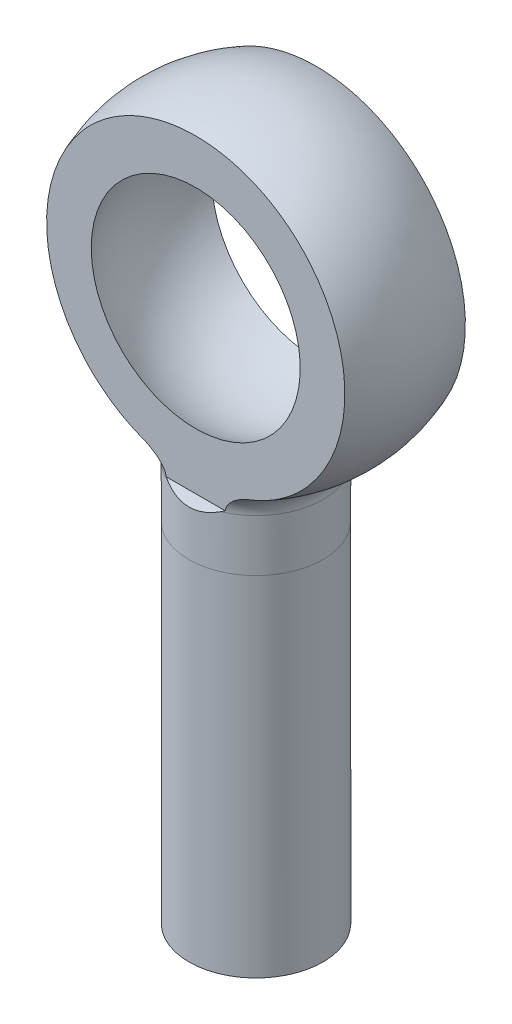
ISO-10303-21;
HEADER;
FILE_DESCRIPTION(('STEP AP214'),'2;1');
FILE_NAME('part.step','',(''),(''),'','','');
FILE_SCHEMA(('AUTOMOTIVE_DESIGN { 1 0 10303 214 1 1 1 1 }'));
ENDSEC;
DATA;
#1=APPLICATION_CONTEXT('core data for automotive mechanical design processes');
#2=APPLICATION_PROTOCOL_DEFINITION('international standard','automotive_design',2000,#1);
#3=PRODUCT_CONTEXT('',#1,'mechanical');
#4=PRODUCT('Part','Part','',(#3));
#5=PRODUCT_RELATED_PRODUCT_CATEGORY('part','',(#4));
#6=PRODUCT_DEFINITION_FORMATION('','',#4);
#7=PRODUCT_DEFINITION_CONTEXT('part definition',#1,'design');
#8=PRODUCT_DEFINITION('design','',#6,#7);
#9=PRODUCT_DEFINITION_SHAPE('','',#8);
#10=(LENGTH_UNIT() NAMED_UNIT(*) SI_UNIT(.MILLI.,.METRE.));
#11=(NAMED_UNIT(*) PLANE_ANGLE_UNIT() SI_UNIT($,.RADIAN.));
#12=(NAMED_UNIT(*) SI_UNIT($,.STERADIAN.) SOLID_ANGLE_UNIT());
#13=UNCERTAINTY_MEASURE_WITH_UNIT(LENGTH_MEASURE(1.E-05),#10,'distance_accuracy_value','');
#14=(GEOMETRIC_REPRESENTATION_CONTEXT(3) GLOBAL_UNCERTAINTY_ASSIGNED_CONTEXT((#13)) GLOBAL_UNIT_ASSIGNED_CONTEXT((#10,
#11,#12)) REPRESENTATION_CONTEXT('',''));
#15=CARTESIAN_POINT('',(0.,0.,0.));
#16=DIRECTION('',(0.,0.,1.));
#17=DIRECTION('',(1.,0.,0.));
#18=AXIS2_PLACEMENT_3D('',#15,#16,#17);
#19=CARTESIAN_POINT('',(0.,-15.875,0.));
#20=DIRECTION('',(0.,-1.,0.));
#21=DIRECTION('',(0.,0.,-1.));
#22=AXIS2_PLACEMENT_3D('',#19,#20,#21);
#23=CYLINDRICAL_SURFACE('',#22,7.9375);
#24=CARTESIAN_POINT('',(0.,-66.675,0.));
#25=DIRECTION('',(0.,1.,0.));
#26=DIRECTION('',(0.,0.,1.));
#27=AXIS2_PLACEMENT_3D('',#24,#25,#26);
#28=CIRCLE('',#27,7.9375);
#29=CARTESIAN_POINT('',(0.,-66.675,7.9375));
#30=VERTEX_POINT('',#29);
#31=EDGE_CURVE('E210',#30,#30,#28,.T.);
#32=ORIENTED_EDGE('',*,*,#31,.T.);
#33=EDGE_LOOP('',(#32));
#34=FACE_BOUND('',#33,.T.);
#35=CARTESIAN_POINT('',(0.,-25.4,0.));
#36=DIRECTION('',(0.,1.,0.));
#37=DIRECTION('',(0.,0.,1.));
#38=AXIS2_PLACEMENT_3D('',#35,#36,#37);
#39=CIRCLE('',#38,7.9375);
#40=CARTESIAN_POINT('',(0.,-25.4,7.9375));
#41=VERTEX_POINT('',#40);
#42=EDGE_CURVE('E11',#41,#41,#39,.T.);
#43=ORIENTED_EDGE('',*,*,#42,.F.);
#44=EDGE_LOOP('',(#43));
#45=FACE_BOUND('',#44,.T.);
#46=ADVANCED_FACE('F32',(#34,#45),#23,.T.);
#47=CARTESIAN_POINT('',(0.,-19.2474145991091,0.));
#48=DIRECTION('',(0.,1.,0.));
#49=DIRECTION('',(0.,0.,1.));
#50=AXIS2_PLACEMENT_3D('',#47,#48,#49);
#51=TOROIDAL_SURFACE('',#50,11.1125,3.175);
#52=CARTESIAN_POINT('',(0.,-19.2474145991091,0.));
#53=DIRECTION('',(0.,1.,0.));
#54=DIRECTION('',(0.,0.,1.));
#55=AXIS2_PLACEMENT_3D('',#52,#53,#54);
#56=CIRCLE('',#55,7.9375);
#57=CARTESIAN_POINT('',(-3.10955935652339,-19.2474145991091,7.30305051730151));
#58=VERTEX_POINT('',#57);
#59=CARTESIAN_POINT('',(-3.1095593565234,-19.2474145991091,-7.30305051730151));
#60=VERTEX_POINT('',#59);
#61=EDGE_CURVE('E49',#58,#60,#56,.F.);
#62=ORIENTED_EDGE('',*,*,#61,.F.);
#63=CARTESIAN_POINT('',(-3.10955935652339,-19.2474145991091,7.30305051730151));
#64=CARTESIAN_POINT('',(-3.17304214766124,-19.2151631506396,7.27598833878579));
#65=CARTESIAN_POINT('',(-3.23623480647958,-19.1825862073713,7.2486530377045));
#66=CARTESIAN_POINT('',(-3.36203984117233,-19.1167813408121,7.19343619844495));
#67=CARTESIAN_POINT('',(-3.4246522172156,-19.0835534177105,7.16555466042564));
#68=CARTESIAN_POINT('',(-3.48697446110822,-19.0499999999997,7.13739999999972));
#69=B_SPLINE_CURVE_WITH_KNOTS('',3,(#63,#64,#65,#66,#67,#68),.UNSPECIFIED.,.F.,.F.,(4,2,4),(0.,
0.228508407762078,0.4570167490272),.UNSPECIFIED.);
#70=CARTESIAN_POINT('',(-3.48697446110849,-19.05,7.1374));
#71=VERTEX_POINT('',#70);
#72=EDGE_CURVE('E43',#58,#71,#69,.T.);
#73=ORIENTED_EDGE('',*,*,#72,.T.);
#74=CARTESIAN_POINT('',(-8.18634441000215,-16.0824007987106,7.1374));
#75=CARTESIAN_POINT('',(-8.45461033069829,-16.066328733575,7.1374));
#76=CARTESIAN_POINT('',(-8.72429189484738,-16.0693292136249,7.1374));
#77=CARTESIAN_POINT('',(-9.25997540927952,-16.1182879434974,7.1374));
#78=CARTESIAN_POINT('',(-9.52597713424766,-16.1642488120548,7.1374));
#79=CARTESIAN_POINT('',(-9.99599897455413,-16.290236551553,7.1374));
#80=CARTESIAN_POINT('',(-10.2021623288707,-16.362091543629,7.1374));
#81=CARTESIAN_POINT('',(-10.5005483189457,-16.494180446961,7.1374));
#82=CARTESIAN_POINT('',(-10.5982359006827,-16.5422842974101,7.1374));
#83=CARTESIAN_POINT('',(-10.7891149384266,-16.6466762160984,7.1374));
#84=CARTESIAN_POINT('',(-10.8823084212089,-16.7029605482042,7.1374));
#85=CARTESIAN_POINT('',(-11.0641232863725,-16.8242793154715,7.1374));
#86=CARTESIAN_POINT('',(-11.1526922817949,-16.8893924511942,7.1374));
#87=CARTESIAN_POINT('',(-11.3231772783695,-17.0277487216986,7.1374));
#88=CARTESIAN_POINT('',(-11.4050969025683,-17.1009873769289,7.1374));
#89=CARTESIAN_POINT('',(-11.5611888059373,-17.2552623330767,7.1374));
#90=CARTESIAN_POINT('',(-11.6353641026378,-17.3362955730566,7.1374));
#91=CARTESIAN_POINT('',(-11.7748616747627,-17.5056534955936,7.1374));
#92=CARTESIAN_POINT('',(-11.8401859375918,-17.5939765341134,7.1374));
#93=CARTESIAN_POINT('',(-11.9518550028769,-17.7634687505778,7.1374));
#94=CARTESIAN_POINT('',(-11.9995772010357,-17.8437326939107,7.1374));
#95=CARTESIAN_POINT('',(-12.0871933321947,-18.0084183127981,7.1374));
#96=CARTESIAN_POINT('',(-12.1270886776974,-18.0928392347013,7.1374));
#97=CARTESIAN_POINT('',(-12.1984624755193,-18.2651065840933,7.1374));
#98=CARTESIAN_POINT('',(-12.2299471577221,-18.3529504206105,7.1374));
#99=CARTESIAN_POINT('',(-12.284065581669,-18.5312902455785,7.1374));
#100=CARTESIAN_POINT('',(-12.3067003283058,-18.621785931662,7.1374));
#101=CARTESIAN_POINT('',(-12.356168394066,-18.8727101312676,7.1374));
#102=CARTESIAN_POINT('',(-12.3736084692336,-19.0351027489541,7.1374));
#103=CARTESIAN_POINT('',(-12.3794965767019,-19.3602853887218,7.1374));
#104=CARTESIAN_POINT('',(-12.3679555677326,-19.523075237341,7.1374));
#105=CARTESIAN_POINT('',(-12.3177204988198,-19.8366375954012,7.1374));
#106=CARTESIAN_POINT('',(-12.280309331988,-19.9876174317936,7.1374));
#107=CARTESIAN_POINT('',(-12.1813347469724,-20.2813997296524,7.1374));
#108=CARTESIAN_POINT('',(-12.119770433459,-20.4242018877567,7.1374));
#109=CARTESIAN_POINT('',(-11.9729311417626,-20.702131982471,7.1374));
#110=CARTESIAN_POINT('',(-11.8870414026876,-20.8369337574829,7.1374));
#111=CARTESIAN_POINT('',(-11.6955986679655,-21.0917110801134,7.1374));
#112=CARTESIAN_POINT('',(-11.5900399602618,-21.2116823039195,7.1374));
#113=CARTESIAN_POINT('',(-11.3524936367968,-21.445104843377,7.1374));
#114=CARTESIAN_POINT('',(-11.2189837826038,-21.5570026467679,7.1374));
#115=CARTESIAN_POINT('',(-10.9370877782918,-21.7600442047659,7.1374));
#116=CARTESIAN_POINT('',(-10.7886956194449,-21.8511795275458,7.1374));
#117=CARTESIAN_POINT('',(-10.4591590868066,-22.0239842477611,7.1374));
#118=CARTESIAN_POINT('',(-10.2763540691325,-22.1024794140072,7.1374));
#119=CARTESIAN_POINT('',(-9.90158932709872,-22.2330280256659,7.1374));
#120=CARTESIAN_POINT('',(-9.70962312408036,-22.2850624459957,7.1374));
#121=CARTESIAN_POINT('',(-9.23137770456704,-22.3822674936143,7.1374));
#122=CARTESIAN_POINT('',(-8.94219804051009,-22.4133612960367,7.1374));
#123=CARTESIAN_POINT('',(-8.36268572043561,-22.4280681437897,7.1374));
#124=CARTESIAN_POINT('',(-8.07235192805783,-22.411596469728,7.1374));
#125=CARTESIAN_POINT('',(-7.42103544275628,-22.3269836642698,7.1374));
#126=CARTESIAN_POINT('',(-7.06164163244379,-22.2463471608774,7.1374));
#127=CARTESIAN_POINT('',(-6.53626316888111,-22.0825652745542,7.1374));
#128=CARTESIAN_POINT('',(-6.36318595614582,-22.020714819537,7.1374));
#129=CARTESIAN_POINT('',(-6.02248255372552,-21.8834270614101,7.1374));
#130=CARTESIAN_POINT('',(-5.85485470507076,-21.8079939399267,7.1374));
#131=CARTESIAN_POINT('',(-5.56193792981059,-21.6618062540766,7.1374));
#132=CARTESIAN_POINT('',(-5.4353664310204,-21.5935991548125,7.1374));
#133=CARTESIAN_POINT('',(-5.18694210166514,-21.4490856454484,7.1374));
#134=CARTESIAN_POINT('',(-5.06508834569833,-21.3727808348411,7.1374));
#135=CARTESIAN_POINT('',(-4.82751058473455,-21.2120528910142,7.1374));
#136=CARTESIAN_POINT('',(-4.71176500952862,-21.1276617706616,7.1374));
#137=CARTESIAN_POINT('',(-4.4874794456567,-20.9498793887008,7.1374));
#138=CARTESIAN_POINT('',(-4.37893356771653,-20.8564956401966,7.1374));
#139=CARTESIAN_POINT('',(-4.18761379011379,-20.6747340780156,7.1374));
#140=CARTESIAN_POINT('',(-4.10345473361283,-20.5878290000602,7.1374));
#141=CARTESIAN_POINT('',(-3.9444935388949,-20.4054511903466,7.1374));
#142=CARTESIAN_POINT('',(-3.86970928552169,-20.3099626616356,7.1374));
#143=CARTESIAN_POINT('',(-3.73287692733787,-20.1076336356136,7.1374));
#144=CARTESIAN_POINT('',(-3.67104739265319,-20.0006383502405,7.1374));
#145=CARTESIAN_POINT('',(-3.59460458719691,-19.8329521424042,7.1374));
#146=CARTESIAN_POINT('',(-3.57186584443942,-19.7759623940727,7.1374));
#147=CARTESIAN_POINT('',(-3.53281638783866,-19.659844459772,7.1374));
#148=CARTESIAN_POINT('',(-3.51650051615519,-19.6007180314824,7.1374));
#149=CARTESIAN_POINT('',(-3.48730511157464,-19.4619734053873,7.1374));
#150=CARTESIAN_POINT('',(-3.47712021459319,-19.3817588782844,7.1374));
#151=CARTESIAN_POINT('',(-3.47088133666928,-19.2207971506109,7.1374));
#152=CARTESIAN_POINT('',(-3.47482364307395,-19.1400500955567,7.1374));
#153=CARTESIAN_POINT('',(-3.49625415512454,-18.9807255752151,7.1374));
#154=CARTESIAN_POINT('',(-3.51369396974151,-18.9021413957269,7.1374));
#155=CARTESIAN_POINT('',(-3.56010188121729,-18.7484705459903,7.1374));
#156=CARTESIAN_POINT('',(-3.5890831328836,-18.6733879763061,7.1374));
#157=CARTESIAN_POINT('',(-3.67820608551895,-18.4795508421502,7.1374));
#158=CARTESIAN_POINT('',(-3.7463124583019,-18.3644973102697,7.1374));
#159=CARTESIAN_POINT('',(-3.8987591200324,-18.1456690582267,7.1374));
#160=CARTESIAN_POINT('',(-3.98315676686753,-18.041936277909,7.1374));
#161=CARTESIAN_POINT('',(-4.15884663707292,-17.8486984681013,7.1374));
#162=CARTESIAN_POINT('',(-4.24968256422073,-17.7587720401846,7.1374));
#163=CARTESIAN_POINT('',(-4.43859531349293,-17.5867983531347,7.1374));
#164=CARTESIAN_POINT('',(-4.53667850414914,-17.5047581732481,7.1374));
#165=CARTESIAN_POINT('',(-4.73859527174432,-17.3476510074325,7.1374));
#166=CARTESIAN_POINT('',(-4.84244111755216,-17.2725998875532,7.1374));
#167=CARTESIAN_POINT('',(-5.05466352696943,-17.1291782661817,7.1374));
#168=CARTESIAN_POINT('',(-5.16304138338956,-17.0608096897855,7.1374));
#169=CARTESIAN_POINT('',(-5.43829658059268,-16.8982093662911,7.1374));
#170=CARTESIAN_POINT('',(-5.6075393903804,-16.8079586232153,7.1374));
#171=CARTESIAN_POINT('',(-5.95300516187439,-16.6417826052334,7.1374));
#172=CARTESIAN_POINT('',(-6.12923206342988,-16.5658655595002,7.1374));
#173=CARTESIAN_POINT('',(-6.4867794892714,-16.4292301720825,7.1374));
#174=CARTESIAN_POINT('',(-6.66807979171416,-16.368459019936,7.1374));
#175=CARTESIAN_POINT('',(-7.03522755539077,-16.2627741977119,7.1374));
#176=CARTESIAN_POINT('',(-7.22107366302185,-16.2178558671591,7.1374));
#177=CARTESIAN_POINT('',(-7.53691915138977,-16.1566388188555,7.1374));
#178=CARTESIAN_POINT('',(-7.66604350605597,-16.1357818155938,7.1374));
#179=CARTESIAN_POINT('',(-7.92544773729248,-16.102572854058,7.1374));
#180=CARTESIAN_POINT('',(-8.05572827574368,-16.0902261348999,7.1374));
#181=CARTESIAN_POINT('',(-8.18634441000215,-16.0824007987106,7.1374));
#182=B_SPLINE_CURVE_WITH_KNOTS('',3,(#74,#75,#76,#77,#78,#79,#80,#81,#82,#83,#84,#85,#86,#87,
#88,#89,#90,#91,#92,#93,#94,#95,#96,#97,#98,#99,#100,#101,#102,#103,#104,#105,#106,#107,#108,
#109,#110,#111,#112,#113,#114,#115,#116,#117,#118,#119,#120,#121,#122,#123,#124,#125,#126,#127,
#128,#129,#130,#131,#132,#133,#134,#135,#136,#137,#138,#139,#140,#141,#142,#143,#144,#145,#146,
#147,#148,#149,#150,#151,#152,#153,#154,#155,#156,#157,#158,#159,#160,#161,#162,#163,#164,#165,
#166,#167,#168,#169,#170,#171,#172,#173,#174,#175,#176,#177,#178,#179,#180,#181),.UNSPECIFIED.,
.T.,.F.,(4,2,2,2,2,2,2,2,2,2,2,2,2,2,2,2,2,2,2,2,2,2,2,2,2,2,2,2,2,2,2,2,2,2,2,2,2,2,2,2,2,2,2,
2,2,2,2,2,2,2,2,2,2,4),(0.,0.805861816116071,1.61177275832488,2.26393312277638,2.5902640334206,
2.91644637007523,3.24575524055478,3.57488345872048,3.90388295166695,4.23280844844947,
4.5125477166761,4.79223645416494,5.07171744462881,5.35116669135668,5.83841083100987,
6.32547075489001,6.7899631242615,7.25447271346298,7.73196860019683,8.20960337304223,
8.73013947776348,9.25088660146714,9.84546804526198,10.4404763864681,11.308197734141,
12.1774655425651,13.2762735591906,13.8272476000247,14.378052304411,14.8091237037816,
15.2401101141114,15.6694557340029,16.0984457086953,16.4608507379442,16.8239369532373,
17.1927279310009,17.3764901302874,17.5601044581559,17.8014668381046,18.0427657922654,
18.2832036304814,18.5239163051599,18.9227080874572,19.3229304150426,19.7058365099292,
20.0890831795604,20.4731796765006,20.8573864991963,21.4320625560314,22.0070675456939,
22.5800386487428,23.1528411668934,23.5449664617196,23.9373329423163),.UNSPECIFIED.);
#183=CARTESIAN_POINT('',(-6.30738822651658,-16.4977839420936,7.1374));
#184=VERTEX_POINT('',#183);
#185=EDGE_CURVE('E105',#71,#184,#182,.T.);
#186=ORIENTED_EDGE('',*,*,#185,.T.);
#187=CARTESIAN_POINT('',(0.,-16.4977839420936,0.));
#188=DIRECTION('',(0.,1.,0.));
#189=DIRECTION('',(0.,0.,1.));
#190=AXIS2_PLACEMENT_3D('',#187,#188,#189);
#191=CIRCLE('',#190,9.525);
#192=CARTESIAN_POINT('',(-6.30738822651658,-16.4977839420936,-7.1374));
#193=VERTEX_POINT('',#192);
#194=EDGE_CURVE('E104',#193,#184,#191,.T.);
#195=ORIENTED_EDGE('',*,*,#194,.F.);
#196=CARTESIAN_POINT('',(-8.18634441000215,-16.0824007987106,-7.1374));
#197=CARTESIAN_POINT('',(-7.83756590302497,-16.1033059056851,-7.1374));
#198=CARTESIAN_POINT('',(-7.49030860765836,-16.1565046374452,-7.1374));
#199=CARTESIAN_POINT('',(-6.97921479087947,-16.2778019941237,-7.1374));
#200=CARTESIAN_POINT('',(-6.80997903540162,-16.3253610034515,-7.1374));
#201=CARTESIAN_POINT('',(-6.47570282840308,-16.4335320955082,-7.1374));
#202=CARTESIAN_POINT('',(-6.31066132348044,-16.4941408637833,-7.1374));
#203=CARTESIAN_POINT('',(-5.9823261651362,-16.6291120605459,-7.1374));
#204=CARTESIAN_POINT('',(-5.81913924595572,-16.7037330033267,-7.1374));
#205=CARTESIAN_POINT('',(-5.49911683166442,-16.8655038146843,-7.1374));
#206=CARTESIAN_POINT('',(-5.34228057147335,-16.9526521682616,-7.1374));
#207=CARTESIAN_POINT('',(-5.03706712140302,-17.1391958943537,-7.1374));
#208=CARTESIAN_POINT('',(-4.88865128244269,-17.2385273296002,-7.1374));
#209=CARTESIAN_POINT('',(-4.67361108342251,-17.3975680385021,-7.1374));
#210=CARTESIAN_POINT('',(-4.60322720192224,-17.452226631906,-7.1374));
#211=CARTESIAN_POINT('',(-4.46540823577519,-17.5651399169593,-7.1374));
#212=CARTESIAN_POINT('',(-4.39797279160082,-17.6233941680592,-7.1374));
#213=CARTESIAN_POINT('',(-4.24573985073809,-17.7629563835602,-7.1374));
#214=CARTESIAN_POINT('',(-4.16224393165364,-17.8457026786666,-7.1374));
#215=CARTESIAN_POINT('',(-4.00341594302029,-18.0189979282804,-7.1374));
#216=CARTESIAN_POINT('',(-3.92809457624926,-18.109556839923,-7.1374));
#217=CARTESIAN_POINT('',(-3.78838308988007,-18.3005873871406,-7.1374));
#218=CARTESIAN_POINT('',(-3.72413281697044,-18.4011636098306,-7.1374));
#219=CARTESIAN_POINT('',(-3.61366252372249,-18.6117832635812,-7.1374));
#220=CARTESIAN_POINT('',(-3.56737774146471,-18.7217909112287,-7.1374));
#221=CARTESIAN_POINT('',(-3.51087105554035,-18.913461951641,-7.1374));
#222=CARTESIAN_POINT('',(-3.49387591868917,-18.9931021770959,-7.1374));
#223=CARTESIAN_POINT('',(-3.47377345168792,-19.1541004624217,-7.1374));
#224=CARTESIAN_POINT('',(-3.47065081770149,-19.2354565297742,-7.1374));
#225=CARTESIAN_POINT('',(-3.4786914440184,-19.3974161696624,-7.1374));
#226=CARTESIAN_POINT('',(-3.48985169616531,-19.4780198970493,-7.1374));
#227=CARTESIAN_POINT('',(-3.52503191687972,-19.6363799294021,-7.1374));
#228=CARTESIAN_POINT('',(-3.54906932678234,-19.7141322192992,-7.1374));
#229=CARTESIAN_POINT('',(-3.62160764334563,-19.9016614961679,-7.1374));
#230=CARTESIAN_POINT('',(-3.67630902974292,-20.0090067483388,-7.1374));
#231=CARTESIAN_POINT('',(-3.80132703416151,-20.2141931325633,-7.1374));
#232=CARTESIAN_POINT('',(-3.87169248728017,-20.3120031348884,-7.1374));
#233=CARTESIAN_POINT('',(-4.01775157590037,-20.4924328335696,-7.1374));
#234=CARTESIAN_POINT('',(-4.0927384628952,-20.5756354405611,-7.1374));
#235=CARTESIAN_POINT('',(-4.24948148501025,-20.7354621827784,-7.1374));
#236=CARTESIAN_POINT('',(-4.33124341694351,-20.8120805678823,-7.1374));
#237=CARTESIAN_POINT('',(-4.5000848489246,-20.959536943612,-7.1374));
#238=CARTESIAN_POINT('',(-4.58717496262241,-21.0303626936239,-7.1374));
#239=CARTESIAN_POINT('',(-4.76552734770957,-21.1665721789459,-7.1374));
#240=CARTESIAN_POINT('',(-4.85679096366291,-21.2319541410385,-7.1374));
#241=CARTESIAN_POINT('',(-5.10557465279448,-21.4000111558629,-7.1374));
#242=CARTESIAN_POINT('',(-5.2662331303185,-21.4980669544601,-7.1374));
#243=CARTESIAN_POINT('',(-5.59522904260266,-21.6804386353178,-7.1374));
#244=CARTESIAN_POINT('',(-5.76357111559795,-21.764746074085,-7.1374));
#245=CARTESIAN_POINT('',(-6.10645300400664,-21.9193517801857,-7.1374));
#246=CARTESIAN_POINT('',(-6.28098855847626,-21.9896594669557,-7.1374));
#247=CARTESIAN_POINT('',(-6.63526063266765,-22.1156579394454,-7.1374));
#248=CARTESIAN_POINT('',(-6.81499811447379,-22.1713460018706,-7.1374));
#249=CARTESIAN_POINT('',(-7.30507245089033,-22.300365915477,-7.1374));
#250=CARTESIAN_POINT('',(-7.61943317191072,-22.3590990779074,-7.1374));
#251=CARTESIAN_POINT('',(-8.25335231170756,-22.4248057896329,-7.1374));
#252=CARTESIAN_POINT('',(-8.57290079960358,-22.4318686909784,-7.1374));
#253=CARTESIAN_POINT('',(-9.13612895376194,-22.3918053125036,-7.1374));
#254=CARTESIAN_POINT('',(-9.38063667799985,-22.3565628387989,-7.1374));
#255=CARTESIAN_POINT('',(-9.86081705072536,-22.247106775983,-7.1374));
#256=CARTESIAN_POINT('',(-10.0964990489947,-22.1729357545245,-7.1374));
#257=CARTESIAN_POINT('',(-10.5109923470605,-21.9996935178979,-7.1374));
#258=CARTESIAN_POINT('',(-10.6925384763965,-21.9072508903313,-7.1374));
#259=CARTESIAN_POINT('',(-10.9515767717276,-21.7472260875484,-7.1374));
#260=CARTESIAN_POINT('',(-11.0357474944882,-21.6902910929714,-7.1374));
#261=CARTESIAN_POINT('',(-11.1988481973666,-21.5693788714049,-7.1374));
#262=CARTESIAN_POINT('',(-11.2777804886891,-21.5054047836371,-7.1374));
#263=CARTESIAN_POINT('',(-11.4301962742157,-21.3700263718739,-7.1374));
#264=CARTESIAN_POINT('',(-11.5036284982007,-21.2985642127793,-7.1374));
#265=CARTESIAN_POINT('',(-11.6433578910279,-21.1490317636901,-7.1374));
#266=CARTESIAN_POINT('',(-11.7096588329184,-21.0709650075352,-7.1374));
#267=CARTESIAN_POINT('',(-11.8342359686068,-20.9086898516884,-7.1374));
#268=CARTESIAN_POINT('',(-11.8925149478551,-20.824483599416,-7.1374));
#269=CARTESIAN_POINT('',(-12.0001747259355,-20.650609638752,-7.1374));
#270=CARTESIAN_POINT('',(-12.0495571842161,-20.5609429530666,-7.1374));
#271=CARTESIAN_POINT('',(-12.1708221094177,-20.3103146557365,-7.1374));
#272=CARTESIAN_POINT('',(-12.2332153381169,-20.1446103314751,-7.1374));
#273=CARTESIAN_POINT('',(-12.3257546986271,-19.8045601676855,-7.1374));
#274=CARTESIAN_POINT('',(-12.3559246491823,-19.6302208108708,-7.1374));
#275=CARTESIAN_POINT('',(-12.3811301992376,-19.2965126989795,-7.1374));
#276=CARTESIAN_POINT('',(-12.3793629368275,-19.1373803453095,-7.1374));
#277=CARTESIAN_POINT('',(-12.3485135390923,-18.8218199442149,-7.1374));
#278=CARTESIAN_POINT('',(-12.3194374092459,-18.665391309919,-7.1374));
#279=CARTESIAN_POINT('',(-12.2361878112819,-18.3628571155508,-7.1374));
#280=CARTESIAN_POINT('',(-12.1825393832326,-18.2166059212736,-7.1374));
#281=CARTESIAN_POINT('',(-12.0525695844767,-17.9345911562157,-7.1374));
#282=CARTESIAN_POINT('',(-11.9762450974991,-17.7988290301348,-7.1374));
#283=CARTESIAN_POINT('',(-11.7995096191769,-17.534200854302,-7.1374));
#284=CARTESIAN_POINT('',(-11.6980937550987,-17.406008325465,-7.1374));
#285=CARTESIAN_POINT('',(-11.4771034987093,-17.1664384776681,-7.1374));
#286=CARTESIAN_POINT('',(-11.3575232600276,-17.0550665956869,-7.1374));
#287=CARTESIAN_POINT('',(-11.0901872347953,-16.8393166032175,-7.1374));
#288=CARTESIAN_POINT('',(-10.9407838176343,-16.736985742837,-7.1374));
#289=CARTESIAN_POINT('',(-10.6288174839368,-16.5549431963733,-7.1374));
#290=CARTESIAN_POINT('',(-10.4662469737868,-16.4752446837317,-7.1374));
#291=CARTESIAN_POINT('',(-10.1057061564118,-16.3273220040396,-7.1374));
#292=CARTESIAN_POINT('',(-9.90619143412694,-16.2628781037203,-7.1374));
#293=CARTESIAN_POINT('',(-9.50026483511547,-16.1623365835992,-7.1374));
#294=CARTESIAN_POINT('',(-9.2938522285191,-16.1262419734187,-7.1374));
#295=CARTESIAN_POINT('',(-8.93673099142475,-16.0867878707363,-7.1374));
#296=CARTESIAN_POINT('',(-8.78667697339741,-16.0770780441499,-7.1374));
#297=CARTESIAN_POINT('',(-8.48643633078836,-16.0703962885566,-7.1374));
#298=CARTESIAN_POINT('',(-8.33624986432827,-16.0734157566394,-7.1374));
#299=CARTESIAN_POINT('',(-8.18634441000215,-16.0824007987106,-7.1374));
#300=B_SPLINE_CURVE_WITH_KNOTS('',3,(#196,#197,#198,#199,#200,#201,#202,#203,#204,#205,#206,
#207,#208,#209,#210,#211,#212,#213,#214,#215,#216,#217,#218,#219,#220,#221,#222,#223,#224,#225,
#226,#227,#228,#229,#230,#231,#232,#233,#234,#235,#236,#237,#238,#239,#240,#241,#242,#243,#244,
#245,#246,#247,#248,#249,#250,#251,#252,#253,#254,#255,#256,#257,#258,#259,#260,#261,#262,#263,
#264,#265,#266,#267,#268,#269,#270,#271,#272,#273,#274,#275,#276,#277,#278,#279,#280,#281,#282,
#283,#284,#285,#286,#287,#288,#289,#290,#291,#292,#293,#294,#295,#296,#297,#298,#299),
.UNSPECIFIED.,.T.,.F.,(4,2,2,2,2,2,2,2,2,2,2,2,2,2,2,2,2,2,2,2,2,2,2,2,2,2,2,2,2,2,2,2,2,2,2,2,
2,2,2,2,2,2,2,2,2,2,2,2,2,2,2,4),(0.,1.04756521528851,1.57458630076796,2.10147368792776,
2.63925751342882,3.17697635679129,3.7119851551404,3.97923079185311,4.2464437496671,
4.59866567634911,4.95134333398666,5.30819286017004,5.66374379765788,5.90698357910241,
6.14995495709409,6.39287517066115,6.63612523999114,6.99550140398047,7.35601407197941,
7.69155334730988,8.02738273880678,8.36390437204409,8.70053519587436,9.26440789825232,
9.8286256068473,10.3924624011522,10.9564041506736,11.9119303588892,12.865803808821,
13.6041430852171,14.3416766780833,14.9501481833446,15.2546835025145,15.5590835544771,
15.8660374600345,16.1728281538928,16.4795120512418,16.7861386841574,17.3140992223789,
17.8416692330282,18.3167467481844,18.7917198137499,19.2569861888646,19.7223165330882,
20.2106696068701,20.6991801959228,21.2403378356863,21.7818098204101,22.4085049521937,
23.0352666062856,23.4858159419367,23.9360608291434),.UNSPECIFIED.);
#301=CARTESIAN_POINT('',(-3.48697446111059,-19.0500000000001,-7.1374));
#302=VERTEX_POINT('',#301);
#303=EDGE_CURVE('E189',#193,#302,#300,.T.);
#304=ORIENTED_EDGE('',*,*,#303,.T.);
#305=CARTESIAN_POINT('',(-3.48697446111002,-19.05,-7.1374));
#306=CARTESIAN_POINT('',(-3.4246522172169,-19.0835534177106,-7.16555466042568));
#307=CARTESIAN_POINT('',(-3.3620398411732,-19.1167813408119,-7.19343619844482));
#308=CARTESIAN_POINT('',(-3.23623480647973,-19.182586207371,-7.24865303770418));
#309=CARTESIAN_POINT('',(-3.17304214766111,-19.2151631506392,-7.27598833878544));
#310=CARTESIAN_POINT('',(-3.10955935652305,-19.2474145991088,-7.30305051730119));
#311=B_SPLINE_CURVE_WITH_KNOTS('',3,(#305,#306,#307,#308,#309,#310),.UNSPECIFIED.,.F.,.F.,(4,2,
4),(0.,0.22850834126574,0.457016749028448),.UNSPECIFIED.);
#312=EDGE_CURVE('E132',#302,#60,#311,.T.);
#313=ORIENTED_EDGE('',*,*,#312,.T.);
#314=EDGE_LOOP('',(#62,#73,#186,#195,#304,#313));
#315=FACE_BOUND('',#314,.T.);
#316=ADVANCED_FACE('F153',(#315),#51,.F.);
#317=CARTESIAN_POINT('',(0.,0.,0.));
#318=DIRECTION('',(0.,-1.,0.));
#319=DIRECTION('',(1.,0.,0.));
#320=AXIS2_PLACEMENT_3D('',#317,#318,#319);
#321=SPHERICAL_SURFACE('',#320,19.05);
#322=ORIENTED_EDGE('',*,*,#194,.T.);
#323=CARTESIAN_POINT('',(0.,0.,7.1374));
#324=DIRECTION('',(0.,0.,-1.));
#325=DIRECTION('',(-1.,0.,0.));
#326=AXIS2_PLACEMENT_3D('',#323,#324,#325);
#327=CIRCLE('',#326,17.6623900206059);
#328=CARTESIAN_POINT('',(6.30738822651658,-16.4977839420936,7.1374));
#329=VERTEX_POINT('',#328);
#330=EDGE_CURVE('E88',#184,#329,#327,.T.);
#331=ORIENTED_EDGE('',*,*,#330,.T.);
#332=CARTESIAN_POINT('',(6.30738822651658,-16.4977839420936,-7.1374));
#333=VERTEX_POINT('',#332);
#334=EDGE_CURVE('E101',#329,#333,#191,.T.);
#335=ORIENTED_EDGE('',*,*,#334,.T.);
#336=CARTESIAN_POINT('',(0.,0.,-7.1374));
#337=DIRECTION('',(0.,0.,1.));
#338=DIRECTION('',(1.,0.,0.));
#339=AXIS2_PLACEMENT_3D('',#336,#337,#338);
#340=CIRCLE('',#339,17.6623900206059);
#341=EDGE_CURVE('E193',#333,#193,#340,.T.);
#342=ORIENTED_EDGE('',*,*,#341,.T.);
#343=EDGE_LOOP('',(#322,#331,#335,#342));
#344=FACE_BOUND('',#343,.T.);
#345=ADVANCED_FACE('F99',(#344),#321,.T.);
#346=ORIENTED_EDGE('',*,*,#42,.T.);
#347=EDGE_LOOP('',(#346));
#348=FACE_BOUND('',#347,.T.);
#349=CARTESIAN_POINT('',(3.10955935652339,-19.2474145991091,-7.30305051730151));
#350=VERTEX_POINT('',#349);
#351=CARTESIAN_POINT('',(3.10955935652339,-19.2474145991091,7.30305051730151));
#352=VERTEX_POINT('',#351);
#353=EDGE_CURVE('E110',#350,#352,#56,.F.);
#354=ORIENTED_EDGE('',*,*,#353,.T.);
#355=CARTESIAN_POINT('',(0.,-10.5439779082182,0.));
#356=DIRECTION('',(0.,-0.642787609686544,-0.766044443118974));
#357=DIRECTION('',(0.,-0.766044443118974,0.642787609686544));
#358=AXIS2_PLACEMENT_3D('',#355,#356,#357);
#359=ELLIPSE('',#358,12.3485578757044,7.9375);
#360=EDGE_CURVE('E175',#352,#58,#359,.T.);
#361=ORIENTED_EDGE('',*,*,#360,.T.);
#362=ORIENTED_EDGE('',*,*,#61,.T.);
#363=CARTESIAN_POINT('',(0.,-10.5439779082182,0.));
#364=DIRECTION('',(0.,0.642787609686544,-0.766044443118974));
#365=DIRECTION('',(0.,-0.766044443118974,-0.642787609686544));
#366=AXIS2_PLACEMENT_3D('',#363,#364,#365);
#367=ELLIPSE('',#366,12.3485578757044,7.9375);
#368=EDGE_CURVE('E123',#60,#350,#367,.F.);
#369=ORIENTED_EDGE('',*,*,#368,.T.);
#370=EDGE_LOOP('',(#354,#361,#362,#369));
#371=FACE_BOUND('',#370,.T.);
#372=ADVANCED_FACE('F156',(#348,#371),#23,.T.);
#373=CARTESIAN_POINT('',(0.,-66.675,0.));
#374=DIRECTION('',(0.,1.,0.));
#375=DIRECTION('',(0.,0.,1.));
#376=AXIS2_PLACEMENT_3D('',#373,#374,#375);
#377=PLANE('',#376);
#378=ORIENTED_EDGE('',*,*,#31,.F.);
#379=EDGE_LOOP('',(#378));
#380=FACE_BOUND('',#379,.T.);
#381=ADVANCED_FACE('F165',(#380),#377,.F.);
#382=ORIENTED_EDGE('',*,*,#334,.F.);
#383=CARTESIAN_POINT('',(3.4731610163042,-19.2235824596882,7.1374));
#384=CARTESIAN_POINT('',(3.47167640395493,-19.3112218834174,7.1374));
#385=CARTESIAN_POINT('',(3.47857395619643,-19.3990888655547,7.1374));
#386=CARTESIAN_POINT('',(3.50814523309214,-19.5721496754575,7.1374));
#387=CARTESIAN_POINT('',(3.53085078667912,-19.6573377469937,7.1374));
#388=CARTESIAN_POINT('',(3.59837023072092,-19.8491801861125,7.1374));
#389=CARTESIAN_POINT('',(3.64789551533514,-19.9541427153431,7.1374));
#390=CARTESIAN_POINT('',(3.76253500267712,-20.1551675045932,7.1374));
#391=CARTESIAN_POINT('',(3.82769316729152,-20.2512035861621,7.1374));
#392=CARTESIAN_POINT('',(3.96227869150648,-20.4266382574702,7.1374));
#393=CARTESIAN_POINT('',(4.03078783539077,-20.5067560633875,7.1374));
#394=CARTESIAN_POINT('',(4.17435890010631,-20.6609448799005,7.1374));
#395=CARTESIAN_POINT('',(4.24942624849184,-20.7350107819604,7.1374));
#396=CARTESIAN_POINT('',(4.40469071996954,-20.8778194489046,7.1374));
#397=CARTESIAN_POINT('',(4.48489731868048,-20.9465518324041,7.1374));
#398=CARTESIAN_POINT('',(4.64933886646985,-21.0790375724393,7.1374));
#399=CARTESIAN_POINT('',(4.73357518256544,-21.1427892197494,7.1374));
#400=CARTESIAN_POINT('',(4.96938875125432,-21.3114215346747,7.1374));
#401=CARTESIAN_POINT('',(5.12437807159456,-21.4115561676504,7.1374));
#402=CARTESIAN_POINT('',(5.44222827396482,-21.5985419979979,7.1374));
#403=CARTESIAN_POINT('',(5.60509413535573,-21.6853846441377,7.1374));
#404=CARTESIAN_POINT('',(5.9373878095877,-21.8458275869275,7.1374));
#405=CARTESIAN_POINT('',(6.1068207984316,-21.9194171689666,7.1374));
#406=CARTESIAN_POINT('',(6.45103680136479,-22.0527674336092,7.1374));
#407=CARTESIAN_POINT('',(6.62581950000427,-22.1125289298246,7.1374));
#408=CARTESIAN_POINT('',(6.98299104800241,-22.218314663529,7.1374));
#409=CARTESIAN_POINT('',(7.16546049134105,-22.2640683527999,7.1374));
#410=CARTESIAN_POINT('',(7.53382218735176,-22.3391294613933,7.1374));
#411=CARTESIAN_POINT('',(7.71971518688632,-22.3684332471388,7.1374));
#412=CARTESIAN_POINT('',(8.09299599414312,-22.4090827906088,7.1374));
#413=CARTESIAN_POINT('',(8.28037839748385,-22.420476915662,7.1374));
#414=CARTESIAN_POINT('',(8.65522198485078,-22.4238991568174,7.1374));
#415=CARTESIAN_POINT('',(8.84268304025736,-22.4159397502153,7.1374));
#416=CARTESIAN_POINT('',(9.26782927598962,-22.3738960062385,7.1374));
#417=CARTESIAN_POINT('',(9.50491364363477,-22.3331339453864,7.1374));
#418=CARTESIAN_POINT('',(9.96943936861364,-22.2142131712214,7.1374));
#419=CARTESIAN_POINT('',(10.196892056951,-22.136099809198,7.1374));
#420=CARTESIAN_POINT('',(10.5987952826524,-21.9562301504387,7.1374));
#421=CARTESIAN_POINT('',(10.7758518716825,-21.8603799766947,7.1374));
#422=CARTESIAN_POINT('',(11.0277439817793,-21.6957859501574,7.1374));
#423=CARTESIAN_POINT('',(11.1094644635588,-21.6374160284983,7.1374));
#424=CARTESIAN_POINT('',(11.2675431230904,-21.5138422556702,7.1374));
#425=CARTESIAN_POINT('',(11.3439036805349,-21.4486414697208,7.1374));
#426=CARTESIAN_POINT('',(11.491035084566,-21.3110519666548,7.1374));
#427=CARTESIAN_POINT('',(11.5617552295952,-21.2386089329712,7.1374));
#428=CARTESIAN_POINT('',(11.6959909442098,-21.0873844809651,7.1374));
#429=CARTESIAN_POINT('',(11.7595102828601,-21.0086064157989,7.1374));
#430=CARTESIAN_POINT('',(11.8784910169292,-20.8452011162485,7.1374));
#431=CARTESIAN_POINT('',(11.9339551441229,-20.7605758792592,7.1374));
#432=CARTESIAN_POINT('',(12.0359972926543,-20.5861726225453,7.1374));
#433=CARTESIAN_POINT('',(12.0825769125627,-20.4963955335715,7.1374));
#434=CARTESIAN_POINT('',(12.196476074902,-20.2454939699718,7.1374));
#435=CARTESIAN_POINT('',(12.2542888236354,-20.0799069752694,7.1374));
#436=CARTESIAN_POINT('',(12.3379698919109,-19.7409789632678,7.1374));
#437=CARTESIAN_POINT('',(12.3638604996721,-19.5676434437563,7.1374));
#438=CARTESIAN_POINT('',(12.381511479026,-19.2356888551613,7.1374));
#439=CARTESIAN_POINT('',(12.3762611583501,-19.0772240599092,7.1374));
#440=CARTESIAN_POINT('',(12.3387489972594,-18.7635594602868,7.1374));
#441=CARTESIAN_POINT('',(12.3064923513983,-18.6083590339134,7.1374));
#442=CARTESIAN_POINT('',(12.2171570216598,-18.3079821967147,7.1374));
#443=CARTESIAN_POINT('',(12.1604758120427,-18.1626867006268,7.1374));
#444=CARTESIAN_POINT('',(12.0247189690852,-17.8830061854739,7.1374));
#445=CARTESIAN_POINT('',(11.9456399862194,-17.7486228021559,7.1374));
#446=CARTESIAN_POINT('',(11.7632626952367,-17.4866481536672,7.1374));
#447=CARTESIAN_POINT('',(11.6588964886326,-17.3598029038111,7.1374));
#448=CARTESIAN_POINT('',(11.4322940119065,-17.1232948490646,7.1374));
#449=CARTESIAN_POINT('',(11.3100513087451,-17.0136382592453,7.1374));
#450=CARTESIAN_POINT('',(11.0370085896696,-16.8014534357084,7.1374));
#451=CARTESIAN_POINT('',(10.8845446591475,-16.701072139445,7.1374));
#452=CARTESIAN_POINT('',(10.5668261912829,-16.5233010194561,7.1374));
#453=CARTESIAN_POINT('',(10.4015660067045,-16.4459214205643,7.1374));
#454=CARTESIAN_POINT('',(10.0351652066473,-16.3031059481033,7.1374));
#455=CARTESIAN_POINT('',(9.83251296758552,-16.241558930933,7.1374));
#456=CARTESIAN_POINT('',(9.420685639113,-16.1471144840415,7.1374));
#457=CARTESIAN_POINT('',(9.21150565085972,-16.1142391343341,7.1374));
#458=CARTESIAN_POINT('',(8.68803171699617,-16.0654682034311,7.1374));
#459=CARTESIAN_POINT('',(8.37220987537471,-16.0656643963126,7.1374));
#460=CARTESIAN_POINT('',(7.74463172061871,-16.1173598797689,7.1374));
#461=CARTESIAN_POINT('',(7.43288397212681,-16.1689537128273,7.1374));
#462=CARTESIAN_POINT('',(6.97123395270853,-16.2803669551308,7.1374));
#463=CARTESIAN_POINT('',(6.81711737243875,-16.3236704259182,7.1374));
#464=CARTESIAN_POINT('',(6.512360518965,-16.4211339173749,7.1374));
#465=CARTESIAN_POINT('',(6.36171952852451,-16.4752916753558,7.1374));
#466=CARTESIAN_POINT('',(6.06459974482324,-16.5939196211777,7.1374));
#467=CARTESIAN_POINT('',(5.9181202977413,-16.6583881784168,7.1374));
#468=CARTESIAN_POINT('',(5.63001007185235,-16.7973323492445,7.1374));
#469=CARTESIAN_POINT('',(5.48837815839896,-16.8718056006875,7.1374));
#470=CARTESIAN_POINT('',(5.24970532840027,-17.0085119142871,7.1374));
#471=CARTESIAN_POINT('',(5.15127886766539,-17.0683369274244,7.1374));
#472=CARTESIAN_POINT('',(4.95787464024225,-17.1933121886398,7.1374));
#473=CARTESIAN_POINT('',(4.86289630975798,-17.2584615604288,7.1374));
#474=CARTESIAN_POINT('',(4.67710788662388,-17.3943062932349,7.1374));
#475=CARTESIAN_POINT('',(4.58629402856441,-17.4649964811623,7.1374));
#476=CARTESIAN_POINT('',(4.4097435452711,-17.6124144449464,7.1374));
#477=CARTESIAN_POINT('',(4.32400468072114,-17.6891395226042,7.1374));
#478=CARTESIAN_POINT('',(4.1451695784945,-17.8627904153555,7.1374));
#479=CARTESIAN_POINT('',(4.05325141193066,-17.9609459660458,7.1374));
#480=CARTESIAN_POINT('',(3.88218753008206,-18.167972363626,7.1374));
#481=CARTESIAN_POINT('',(3.80302691570795,-18.2768304685182,7.1374));
#482=CARTESIAN_POINT('',(3.68485895410859,-18.4725665285567,7.1374));
#483=CARTESIAN_POINT('',(3.64090137576552,-18.5564166993516,7.1374));
#484=CARTESIAN_POINT('',(3.56635959356066,-18.729819354181,7.1374));
#485=CARTESIAN_POINT('',(3.53573636569716,-18.8193543079074,7.1374));
#486=CARTESIAN_POINT('',(3.50127845932629,-18.9621012772661,7.1374));
#487=CARTESIAN_POINT('',(3.49158564956045,-19.0139221690699,7.1374));
#488=CARTESIAN_POINT('',(3.47797266941665,-19.11832873677,7.1374));
#489=CARTESIAN_POINT('',(3.47405321174222,-19.1709145062792,7.1374));
#490=CARTESIAN_POINT('',(3.4731610163042,-19.2235824596882,7.1374));
#491=B_SPLINE_CURVE_WITH_KNOTS('',3,(#383,#384,#385,#386,#387,#388,#389,#390,#391,#392,#393,
#394,#395,#396,#397,#398,#399,#400,#401,#402,#403,#404,#405,#406,#407,#408,#409,#410,#411,#412,
#413,#414,#415,#416,#417,#418,#419,#420,#421,#422,#423,#424,#425,#426,#427,#428,#429,#430,#431,
#432,#433,#434,#435,#436,#437,#438,#439,#440,#441,#442,#443,#444,#445,#446,#447,#448,#449,#450,
#451,#452,#453,#454,#455,#456,#457,#458,#459,#460,#461,#462,#463,#464,#465,#466,#467,#468,#469,
#470,#471,#472,#473,#474,#475,#476,#477,#478,#479,#480,#481,#482,#483,#484,#485,#486,#487,#488,
#489,#490),.UNSPECIFIED.,.T.,.F.,(4,2,2,2,2,2,2,2,2,2,2,2,2,2,2,2,2,2,2,2,2,2,2,2,2,2,2,2,2,2,2,
2,2,2,2,2,2,2,2,2,2,2,2,2,2,2,2,2,2,2,2,2,2,4),(0.,0.262725975314586,0.525982477079588,
0.872172421747751,1.21934755438999,1.53514243463966,1.851201187638,2.16786045487401,
2.48462791618882,3.03740711150452,3.59054044895719,4.14411898613971,4.69766494377948,
5.26131099159122,5.82508149279672,6.38732682758552,6.94920977678392,7.66807669965664,
8.38607299483718,8.98737343750532,9.28833397821245,9.58916004242557,9.89244106750309,
10.1955626082489,10.4985811097251,10.8015450381797,11.3245446001378,11.8471787936836,
12.3205096685297,12.7937495210708,13.2595628542098,13.7254458852683,14.2162095802672,
14.7071503181654,15.2526573706328,15.7984065533353,16.4314301387358,17.0649407854039,
18.0073021435473,18.9514001182894,19.4313229254771,19.9111457916506,20.3908928511059,
20.870526838911,21.2159186866671,21.5612538034706,21.9062702589093,22.2511333248995,
22.653840298304,23.056073502055,23.3392817095835,23.6216554228043,23.7795242337275,
23.9374125314639),.UNSPECIFIED.);
#492=CARTESIAN_POINT('',(3.48697446110924,-19.0500000000004,7.1374));
#493=VERTEX_POINT('',#492);
#494=EDGE_CURVE('E84',#329,#493,#491,.T.);
#495=ORIENTED_EDGE('',*,*,#494,.T.);
#496=CARTESIAN_POINT('',(3.48697446110643,-19.05,7.1374));
#497=CARTESIAN_POINT('',(3.42465221721428,-19.083553417711,7.16555466042604));
#498=CARTESIAN_POINT('',(3.36203984117137,-19.1167813408126,7.19343619844536));
#499=CARTESIAN_POINT('',(3.23623480647911,-19.1825862073716,7.24865303770471));
#500=CARTESIAN_POINT('',(3.17304214766089,-19.2151631506396,7.2759883387858));
#501=CARTESIAN_POINT('',(3.10955935652305,-19.2474145991088,7.3030505173012));
#502=B_SPLINE_CURVE_WITH_KNOTS('',3,(#496,#497,#498,#499,#500,#501),.UNSPECIFIED.,.F.,.F.,(4,2,
4),(0.,0.228508341264272,0.457016749025497),.UNSPECIFIED.);
#503=EDGE_CURVE('E179',#493,#352,#502,.T.);
#504=ORIENTED_EDGE('',*,*,#503,.T.);
#505=ORIENTED_EDGE('',*,*,#353,.F.);
#506=CARTESIAN_POINT('',(3.10955935652339,-19.2474145991091,-7.30305051730151));
#507=CARTESIAN_POINT('',(3.17304214766098,-19.2151631506398,-7.2759883387859));
#508=CARTESIAN_POINT('',(3.23623480647906,-19.1825862073716,-7.24865303770473));
#509=CARTESIAN_POINT('',(3.36203984117129,-19.1167813408126,-7.19343619844541));
#510=CARTESIAN_POINT('',(3.4246522172143,-19.0835534177112,-7.16555466042622));
#511=CARTESIAN_POINT('',(3.48697446110667,-19.0500000000005,-7.13740000000042));
#512=B_SPLINE_CURVE_WITH_KNOTS('',3,(#506,#507,#508,#509,#510,#511),.UNSPECIFIED.,.F.,.F.,(4,2,
4),(0.,0.228508407761133,0.457016749025313),.UNSPECIFIED.);
#513=CARTESIAN_POINT('',(3.48697446110843,-19.0500000000004,-7.1374));
#514=VERTEX_POINT('',#513);
#515=EDGE_CURVE('E126',#350,#514,#512,.T.);
#516=ORIENTED_EDGE('',*,*,#515,.T.);
#517=CARTESIAN_POINT('',(3.4731610163042,-19.2235824596882,-7.1374));
#518=CARTESIAN_POINT('',(3.4747259324061,-19.1333738827771,-7.1374));
#519=CARTESIAN_POINT('',(3.48517892024519,-19.043257734183,-7.1374));
#520=CARTESIAN_POINT('',(3.52227074189156,-18.8663924766458,-7.1374));
#521=CARTESIAN_POINT('',(3.54894645123276,-18.7796515191335,-7.1374));
#522=CARTESIAN_POINT('',(3.62679918000626,-18.5817841655311,-7.1374));
#523=CARTESIAN_POINT('',(3.68329092252371,-18.4727928866686,-7.1374));
#524=CARTESIAN_POINT('',(3.8121599663537,-18.2646768908463,-7.1374));
#525=CARTESIAN_POINT('',(3.88458217322222,-18.1655812399053,-7.1374));
#526=CARTESIAN_POINT('',(4.03463773435923,-17.9830346903647,-7.1374));
#527=CARTESIAN_POINT('',(4.11154243987519,-17.8989732260006,-7.1374));
#528=CARTESIAN_POINT('',(4.27217890377149,-17.7375836574543,-7.1374));
#529=CARTESIAN_POINT('',(4.35591645042199,-17.6602613793052,-7.1374));
#530=CARTESIAN_POINT('',(4.52875343512929,-17.5115405962446,-7.1374));
#531=CARTESIAN_POINT('',(4.61786331122173,-17.4401543091944,-7.1374));
#532=CARTESIAN_POINT('',(4.80029595148607,-17.3029626886227,-7.1374));
#533=CARTESIAN_POINT('',(4.89362005014654,-17.2371591422095,-7.1374));
#534=CARTESIAN_POINT('',(5.14594766195967,-17.0695116888878,-7.1374));
#535=CARTESIAN_POINT('',(5.30800133775381,-16.9722319363877,-7.1374));
#536=CARTESIAN_POINT('',(5.63971485424569,-16.7915181989901,-7.1374));
#537=CARTESIAN_POINT('',(5.80937916308934,-16.7080924864791,-7.1374));
#538=CARTESIAN_POINT('',(6.15484362213609,-16.5554141359435,-7.1374));
#539=CARTESIAN_POINT('',(6.33063924128619,-16.4861512808495,-7.1374));
#540=CARTESIAN_POINT('',(6.68737276578784,-16.3624500908338,-7.1374));
#541=CARTESIAN_POINT('',(6.86831155580872,-16.3080143235482,-7.1374));
#542=CARTESIAN_POINT('',(7.35780258703242,-16.1836530005799,-7.1374));
#543=CARTESIAN_POINT('',(7.67016069272821,-16.1280208949771,-7.1374));
#544=CARTESIAN_POINT('',(8.29960454966971,-16.0680795670827,-7.1374));
#545=CARTESIAN_POINT('',(8.61668128360039,-16.063682571792,-7.1374));
#546=CARTESIAN_POINT('',(9.17579846273427,-16.1079988380924,-7.1374));
#547=CARTESIAN_POINT('',(9.41874654827563,-16.1450430159615,-7.1374));
#548=CARTESIAN_POINT('',(9.89552905844689,-16.2578555323391,-7.1374));
#549=CARTESIAN_POINT('',(10.1293730707642,-16.3335818776379,-7.1374));
#550=CARTESIAN_POINT('',(10.5404269395818,-16.5094053305103,-7.1374));
#551=CARTESIAN_POINT('',(10.7204030871026,-16.6029524877408,-7.1374));
#552=CARTESIAN_POINT('',(10.9769607178782,-16.764435408952,-7.1374));
#553=CARTESIAN_POINT('',(11.0602829308088,-16.8218233043211,-7.1374));
#554=CARTESIAN_POINT('',(11.2216510567706,-16.9435661369345,-7.1374));
#555=CARTESIAN_POINT('',(11.2996992926319,-17.0079179741143,-7.1374));
#556=CARTESIAN_POINT('',(11.4503054962507,-17.1439651469337,-7.1374));
#557=CARTESIAN_POINT('',(11.5228124529044,-17.2157170606341,-7.1374));
#558=CARTESIAN_POINT('',(11.6606755150162,-17.3657340494464,-7.1374));
#559=CARTESIAN_POINT('',(11.7260353865672,-17.4439956556794,-7.1374));
#560=CARTESIAN_POINT('',(11.848728168949,-17.6065592569534,-7.1374));
#561=CARTESIAN_POINT('',(11.9060637968604,-17.6908591926737,-7.1374));
#562=CARTESIAN_POINT('',(12.0118503123933,-17.8648146071552,-7.1374));
#563=CARTESIAN_POINT('',(12.0603028308737,-17.9544690988533,-7.1374));
#564=CARTESIAN_POINT('',(12.1791788352088,-18.2051325169389,-7.1374));
#565=CARTESIAN_POINT('',(12.2401028206483,-18.3707966028063,-7.1374));
#566=CARTESIAN_POINT('',(12.3298030222086,-18.7104804530173,-7.1374));
#567=CARTESIAN_POINT('',(12.3586025237203,-18.8844940696602,-7.1374));
#568=CARTESIAN_POINT('',(12.381396648477,-19.2176392018057,-7.1374));
#569=CARTESIAN_POINT('',(12.3785200083073,-19.3765615891361,-7.1374));
#570=CARTESIAN_POINT('',(12.3455484259912,-19.6915228425085,-7.1374));
#571=CARTESIAN_POINT('',(12.3154592262494,-19.8475623098169,-7.1374));
#572=CARTESIAN_POINT('',(12.2302744544931,-20.1494146469707,-7.1374));
#573=CARTESIAN_POINT('',(12.1756628447379,-20.2953651588522,-7.1374));
#574=CARTESIAN_POINT('',(12.0438551848031,-20.5766434562593,-7.1374));
#575=CARTESIAN_POINT('',(11.9666560123467,-20.7119697699207,-7.1374));
#576=CARTESIAN_POINT('',(11.7881318983837,-20.9757596394052,-7.1374));
#577=CARTESIAN_POINT('',(11.6857819317148,-21.1035270341692,-7.1374));
#578=CARTESIAN_POINT('',(11.4630129655106,-21.3421327925212,-7.1374));
#579=CARTESIAN_POINT('',(11.3425875638879,-21.4529651297478,-7.1374));
#580=CARTESIAN_POINT('',(11.0734344457605,-21.6675996923164,-7.1374));
#581=CARTESIAN_POINT('',(10.9230527763485,-21.7693222407863,-7.1374));
#582=CARTESIAN_POINT('',(10.6092643308057,-21.9500182276763,-7.1374));
#583=CARTESIAN_POINT('',(10.4458519346049,-22.0289817817947,-7.1374));
#584=CARTESIAN_POINT('',(10.0835028704561,-22.1752752740035,-7.1374));
#585=CARTESIAN_POINT('',(9.88303248253415,-22.2387965633054,-7.1374));
#586=CARTESIAN_POINT('',(9.47526765062156,-22.3374331296148,-7.1374));
#587=CARTESIAN_POINT('',(9.26796793328262,-22.3725258935585,-7.1374));
#588=CARTESIAN_POINT('',(8.74934350286757,-22.4269578953788,-7.1374));
#589=CARTESIAN_POINT('',(8.4363106808106,-22.4304112467495,-7.1374));
#590=CARTESIAN_POINT('',(7.81387152134892,-22.386440159109,-7.1374));
#591=CARTESIAN_POINT('',(7.50447232742528,-22.3389284181534,-7.1374));
#592=CARTESIAN_POINT('',(6.89106919647159,-22.1984898290797,-7.1374));
#593=CARTESIAN_POINT('',(6.58722715832445,-22.104858976507,-7.1374));
#594=CARTESIAN_POINT('',(6.14351281251789,-21.933945429433,-7.1374));
#595=CARTESIAN_POINT('',(5.99756571548585,-21.8718684936008,-7.1374));
#596=CARTESIAN_POINT('',(5.71026797179513,-21.7378302898438,-7.1374));
#597=CARTESIAN_POINT('',(5.56891640078377,-21.6658710250726,-7.1374));
#598=CARTESIAN_POINT('',(5.32388767439179,-21.5300124410626,-7.1374));
#599=CARTESIAN_POINT('',(5.21908827494354,-21.4681255198813,-7.1374));
#600=CARTESIAN_POINT('',(5.01321254159413,-21.3384499758244,-7.1374));
#601=CARTESIAN_POINT('',(4.9121356093688,-21.2706623073386,-7.1374));
#602=CARTESIAN_POINT('',(4.71454292351113,-21.1289848421494,-7.1374));
#603=CARTESIAN_POINT('',(4.618021107453,-21.0551035374686,-7.1374));
#604=CARTESIAN_POINT('',(4.43051052682172,-20.9006744089465,-7.1374));
#605=CARTESIAN_POINT('',(4.33951885794964,-20.8201301377408,-7.1374));
#606=CARTESIAN_POINT('',(4.1577528779762,-20.6448585031091,-7.1374));
#607=CARTESIAN_POINT('',(4.06756753522895,-20.5495129674439,-7.1374));
#608=CARTESIAN_POINT('',(3.8990607119421,-20.3486830837729,-7.1374));
#609=CARTESIAN_POINT('',(3.8207305675551,-20.243206232844,-7.1374));
#610=CARTESIAN_POINT('',(3.69938922197983,-20.0485861007267,-7.1374));
#611=CARTESIAN_POINT('',(3.65244203940292,-19.9619337841562,-7.1374));
#612=CARTESIAN_POINT('',(3.57269633156919,-19.7823714937832,-7.1374));
#613=CARTESIAN_POINT('',(3.53985778500741,-19.6894800965459,-7.1374));
#614=CARTESIAN_POINT('',(3.50112048914849,-19.5337695397502,-7.1374));
#615=CARTESIAN_POINT('',(3.48976755966589,-19.4723003580494,-7.1374));
#616=CARTESIAN_POINT('',(3.47524752537918,-19.3484000688728,-7.1374));
#617=CARTESIAN_POINT('',(3.47207874723137,-19.2859691606594,-7.1374));
#618=CARTESIAN_POINT('',(3.4731610163042,-19.2235824596882,-7.1374));
#619=B_SPLINE_CURVE_WITH_KNOTS('',3,(#517,#518,#519,#520,#521,#522,#523,#524,#525,#526,#527,
#528,#529,#530,#531,#532,#533,#534,#535,#536,#537,#538,#539,#540,#541,#542,#543,#544,#545,#546,
#547,#548,#549,#550,#551,#552,#553,#554,#555,#556,#557,#558,#559,#560,#561,#562,#563,#564,#565,
#566,#567,#568,#569,#570,#571,#572,#573,#574,#575,#576,#577,#578,#579,#580,#581,#582,#583,#584,
#585,#586,#587,#588,#589,#590,#591,#592,#593,#594,#595,#596,#597,#598,#599,#600,#601,#602,#603,
#604,#605,#606,#607,#608,#609,#610,#611,#612,#613,#614,#615,#616,#617,#618),.UNSPECIFIED.,.T.,
.F.,(4,2,2,2,2,2,2,2,2,2,2,2,2,2,2,2,2,2,2,2,2,2,2,2,2,2,2,2,2,2,2,2,2,2,2,2,2,2,2,2,2,2,2,2,2,
2,2,2,2,2,4),(0.,0.270387158974772,0.541391238700903,0.907575871744212,1.27480626194165,
1.61611581552486,1.9577175639223,2.30000585991291,2.64240331664621,3.2086556018215,
3.77524479555939,4.3414237991503,4.9077007868295,5.85569448348647,6.80206389345026,
7.53657590963455,8.27029223172128,8.87609978932413,9.17930003885992,9.48236586688119,
9.78795004998974,10.0933724242886,10.3986911283253,10.7039537223466,11.2302823822832,
11.7562292851506,12.2307334945196,12.7051375971879,13.1705646900411,13.6360561492591,
14.1251562625445,14.6144300194005,15.1569811945192,15.6997676474581,16.3283038452124,
16.9573373069099,17.8913348879132,18.8269349424057,19.7772814005256,20.252797564197,
20.7282174823529,21.0931680391256,21.4580596779014,21.8224511321541,22.1866495331032,
22.5797172215118,22.9724962521386,23.267274426717,23.5612108066688,23.7482441616006,
23.9352392723876),.UNSPECIFIED.);
#620=EDGE_CURVE('E109',#514,#333,#619,.T.);
#621=ORIENTED_EDGE('',*,*,#620,.T.);
#622=EDGE_LOOP('',(#382,#495,#504,#505,#516,#621));
#623=FACE_BOUND('',#622,.T.);
#624=ADVANCED_FACE('F107',(#623),#51,.F.);
#625=CARTESIAN_POINT('',(-27.94,-20.6375,-7.1374));
#626=DIRECTION('',(0.,0.,1.));
#627=DIRECTION('',(1.,0.,0.));
#628=AXIS2_PLACEMENT_3D('',#625,#626,#627);
#629=PLANE('',#628);
#630=CARTESIAN_POINT('',(0.,0.,-7.1374));
#631=DIRECTION('',(0.,0.,1.));
#632=DIRECTION('',(1.,0.,0.));
#633=AXIS2_PLACEMENT_3D('',#630,#631,#632);
#634=CIRCLE('',#633,12.3770019588752);
#635=CARTESIAN_POINT('',(12.3770019588752,0.,-7.1374));
#636=VERTEX_POINT('',#635);
#637=EDGE_CURVE('E116',#636,#636,#634,.F.);
#638=ORIENTED_EDGE('',*,*,#637,.F.);
#639=EDGE_LOOP('',(#638));
#640=FACE_BOUND('',#639,.T.);
#641=ORIENTED_EDGE('',*,*,#620,.F.);
#642=DIRECTION('',(-1.,0.,0.));
#643=VECTOR('',#642,1.);
#644=CARTESIAN_POINT('',(-3.47295659201206,-19.05,-7.1374));
#645=LINE('',#644,#643);
#646=EDGE_CURVE('E112',#514,#302,#645,.T.);
#647=ORIENTED_EDGE('',*,*,#646,.T.);
#648=ORIENTED_EDGE('',*,*,#303,.F.);
#649=ORIENTED_EDGE('',*,*,#341,.F.);
#650=EDGE_LOOP('',(#641,#647,#648,#649));
#651=FACE_BOUND('',#650,.T.);
#652=ADVANCED_FACE('F192',(#640,#651),#629,.F.);
#653=CARTESIAN_POINT('',(0.,0.,0.));
#654=DIRECTION('',(0.,-1.,0.));
#655=DIRECTION('',(1.,0.,0.));
#656=AXIS2_PLACEMENT_3D('',#653,#654,#655);
#657=SPHERICAL_SURFACE('',#656,14.2875);
#658=CARTESIAN_POINT('',(0.,0.,0.));
#659=DIRECTION('',(0.,0.,-1.));
#660=DIRECTION('',(-1.,0.,0.));
#661=AXIS2_PLACEMENT_3D('',#658,#659,#660);
#662=SPHERICAL_SURFACE('',#661,14.2875);
#663=CARTESIAN_POINT('',(0.,0.,7.1374));
#664=DIRECTION('',(0.,0.,-1.));
#665=DIRECTION('',(-1.,0.,0.));
#666=AXIS2_PLACEMENT_3D('',#663,#664,#665);
#667=CIRCLE('',#666,12.3770019588752);
#668=CARTESIAN_POINT('',(-12.3770019588752,0.,7.1374));
#669=VERTEX_POINT('',#668);
#670=EDGE_CURVE('E95',#669,#669,#667,.F.);
#671=ORIENTED_EDGE('',*,*,#670,.T.);
#672=EDGE_LOOP('',(#671));
#673=FACE_BOUND('',#672,.T.);
#674=ORIENTED_EDGE('',*,*,#637,.T.);
#675=EDGE_LOOP('',(#674));
#676=FACE_BOUND('',#675,.T.);
#677=ADVANCED_FACE('F149',(#673,#676),#662,.F.);
#678=CARTESIAN_POINT('',(-27.94,-20.6375,7.1374));
#679=DIRECTION('',(0.,0.,-1.));
#680=DIRECTION('',(1.,0.,0.));
#681=AXIS2_PLACEMENT_3D('',#678,#679,#680);
#682=PLANE('',#681);
#683=ORIENTED_EDGE('',*,*,#670,.F.);
#684=EDGE_LOOP('',(#683));
#685=FACE_BOUND('',#684,.T.);
#686=ORIENTED_EDGE('',*,*,#185,.F.);
#687=DIRECTION('',(1.,0.,0.));
#688=VECTOR('',#687,1.);
#689=CARTESIAN_POINT('',(-27.94,-19.05,7.1374));
#690=LINE('',#689,#688);
#691=EDGE_CURVE('E91',#71,#493,#690,.T.);
#692=ORIENTED_EDGE('',*,*,#691,.T.);
#693=ORIENTED_EDGE('',*,*,#494,.F.);
#694=ORIENTED_EDGE('',*,*,#330,.F.);
#695=EDGE_LOOP('',(#686,#692,#693,#694));
#696=FACE_BOUND('',#695,.T.);
#697=ADVANCED_FACE('F87',(#685,#696),#682,.F.);
#698=CARTESIAN_POINT('',(-27.94,-20.6375,-8.46947066449396));
#699=DIRECTION('',(0.,0.642787609686544,-0.766044443118974));
#700=DIRECTION('',(0.,0.766044443118974,0.642787609686544));
#701=AXIS2_PLACEMENT_3D('',#698,#699,#700);
#702=PLANE('',#701);
#703=ORIENTED_EDGE('',*,*,#312,.F.);
#704=ORIENTED_EDGE('',*,*,#646,.F.);
#705=ORIENTED_EDGE('',*,*,#515,.F.);
#706=ORIENTED_EDGE('',*,*,#368,.F.);
#707=EDGE_LOOP('',(#703,#704,#705,#706));
#708=FACE_BOUND('',#707,.T.);
#709=ADVANCED_FACE('F139',(#708),#702,.T.);
#710=CARTESIAN_POINT('',(-27.94,-19.05,7.1374));
#711=DIRECTION('',(0.,-0.642787609686544,-0.766044443118974));
#712=DIRECTION('',(0.,0.766044443118974,-0.642787609686544));
#713=AXIS2_PLACEMENT_3D('',#710,#711,#712);
#714=PLANE('',#713);
#715=ORIENTED_EDGE('',*,*,#72,.F.);
#716=ORIENTED_EDGE('',*,*,#360,.F.);
#717=ORIENTED_EDGE('',*,*,#503,.F.);
#718=ORIENTED_EDGE('',*,*,#691,.F.);
#719=EDGE_LOOP('',(#715,#716,#717,#718));
#720=FACE_BOUND('',#719,.T.);
#721=ADVANCED_FACE('F34',(#720),#714,.F.);
#722=CLOSED_SHELL('',(#46,#316,#345,#372,#381,#624,#652,#677,#697,#709,#721));
#723=MANIFOLD_SOLID_BREP('B2',#722);
#724=ADVANCED_BREP_SHAPE_REPRESENTATION('',(#18,#723),#14);
#725=SHAPE_DEFINITION_REPRESENTATION(#9,#724);
ENDSEC;
END-ISO-10303-21;
